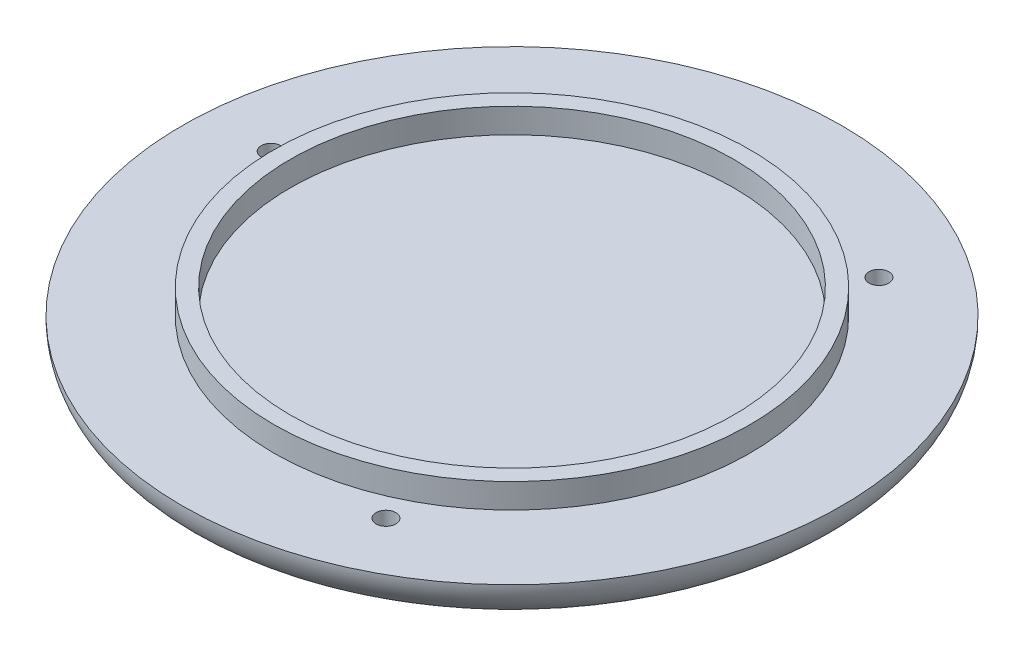
ISO-10303-21;
HEADER;
FILE_DESCRIPTION(('STEP AP214'),'2;1');
FILE_NAME('part.step','',(''),(''),'','','');
FILE_SCHEMA(('AUTOMOTIVE_DESIGN { 1 0 10303 214 1 1 1 1 }'));
ENDSEC;
DATA;
#1=APPLICATION_CONTEXT('core data for automotive mechanical design processes');
#2=APPLICATION_PROTOCOL_DEFINITION('international standard','automotive_design',2000,#1);
#3=PRODUCT_CONTEXT('',#1,'mechanical');
#4=PRODUCT('Part','Part','',(#3));
#5=PRODUCT_RELATED_PRODUCT_CATEGORY('part','',(#4));
#6=PRODUCT_DEFINITION_FORMATION('','',#4);
#7=PRODUCT_DEFINITION_CONTEXT('part definition',#1,'design');
#8=PRODUCT_DEFINITION('design','',#6,#7);
#9=PRODUCT_DEFINITION_SHAPE('','',#8);
#10=(LENGTH_UNIT() NAMED_UNIT(*) SI_UNIT(.MILLI.,.METRE.));
#11=(NAMED_UNIT(*) PLANE_ANGLE_UNIT() SI_UNIT($,.RADIAN.));
#12=(NAMED_UNIT(*) SI_UNIT($,.STERADIAN.) SOLID_ANGLE_UNIT());
#13=UNCERTAINTY_MEASURE_WITH_UNIT(LENGTH_MEASURE(1.E-05),#10,'distance_accuracy_value','');
#14=(GEOMETRIC_REPRESENTATION_CONTEXT(3) GLOBAL_UNCERTAINTY_ASSIGNED_CONTEXT((#13)) GLOBAL_UNIT_ASSIGNED_CONTEXT((#10,
#11,#12)) REPRESENTATION_CONTEXT('',''));
#15=CARTESIAN_POINT('',(0.,0.,0.));
#16=DIRECTION('',(0.,0.,1.));
#17=DIRECTION('',(1.,0.,0.));
#18=AXIS2_PLACEMENT_3D('',#15,#16,#17);
#19=CARTESIAN_POINT('',(0.,0.,0.));
#20=DIRECTION('',(0.,1.,0.));
#21=DIRECTION('',(0.,0.,1.));
#22=AXIS2_PLACEMENT_3D('',#19,#20,#21);
#23=PLANE('',#22);
#24=CARTESIAN_POINT('',(0.,0.,0.));
#25=DIRECTION('',(0.,1.,0.));
#26=DIRECTION('',(0.,0.,1.));
#27=AXIS2_PLACEMENT_3D('',#24,#25,#26);
#28=CIRCLE('',#27,35.);
#29=CARTESIAN_POINT('',(0.,0.,35.));
#30=VERTEX_POINT('',#29);
#31=EDGE_CURVE('E10',#30,#30,#28,.F.);
#32=ORIENTED_EDGE('',*,*,#31,.T.);
#33=EDGE_LOOP('',(#32));
#34=FACE_BOUND('',#33,.T.);
#35=CARTESIAN_POINT('',(-31.8896219755047,0.,-2.65556213623557));
#36=DIRECTION('',(0.,-1.,0.));
#37=DIRECTION('',(0.,0.,-1.));
#38=AXIS2_PLACEMENT_3D('',#35,#36,#37);
#39=CIRCLE('',#38,2.15);
#40=CARTESIAN_POINT('',(-31.8896219755047,0.,-4.80556213623557));
#41=VERTEX_POINT('',#40);
#42=EDGE_CURVE('E75',#41,#41,#39,.T.);
#43=ORIENTED_EDGE('',*,*,#42,.F.);
#44=EDGE_LOOP('',(#43));
#45=FACE_BOUND('',#44,.T.);
#46=CARTESIAN_POINT('',(13.6450267164444,0.,28.9450038159873));
#47=DIRECTION('',(0.,-1.,0.));
#48=DIRECTION('',(0.,0.,-1.));
#49=AXIS2_PLACEMENT_3D('',#46,#47,#48);
#50=CIRCLE('',#49,2.15);
#51=CARTESIAN_POINT('',(13.6450267164444,0.,26.7950038159873));
#52=VERTEX_POINT('',#51);
#53=EDGE_CURVE('E63',#52,#52,#50,.T.);
#54=ORIENTED_EDGE('',*,*,#53,.F.);
#55=EDGE_LOOP('',(#54));
#56=FACE_BOUND('',#55,.T.);
#57=CARTESIAN_POINT('',(18.2445952590606,0.,-26.2894416797517));
#58=DIRECTION('',(0.,-1.,0.));
#59=DIRECTION('',(0.,0.,-1.));
#60=AXIS2_PLACEMENT_3D('',#57,#58,#59);
#61=CIRCLE('',#60,2.15);
#62=CARTESIAN_POINT('',(18.2445952590606,0.,-28.4394416797517));
#63=VERTEX_POINT('',#62);
#64=EDGE_CURVE('E87',#63,#63,#61,.T.);
#65=ORIENTED_EDGE('',*,*,#64,.F.);
#66=EDGE_LOOP('',(#65));
#67=FACE_BOUND('',#66,.T.);
#68=ADVANCED_FACE('F34',(#34,#45,#56,#67),#23,.F.);
#69=CARTESIAN_POINT('',(0.,5.,0.));
#70=DIRECTION('',(0.,1.,0.));
#71=DIRECTION('',(0.,0.,1.));
#72=AXIS2_PLACEMENT_3D('',#69,#70,#71);
#73=PLANE('',#72);
#74=CARTESIAN_POINT('',(18.2445952590606,5.,-26.2894416797517));
#75=DIRECTION('',(0.,1.,0.));
#76=DIRECTION('',(0.,0.,1.));
#77=AXIS2_PLACEMENT_3D('',#74,#75,#76);
#78=CIRCLE('',#77,1.2);
#79=CARTESIAN_POINT('',(18.2445952590606,5.,-25.0894416797517));
#80=VERTEX_POINT('',#79);
#81=EDGE_CURVE('E78',#80,#80,#78,.T.);
#82=ORIENTED_EDGE('',*,*,#81,.F.);
#83=EDGE_LOOP('',(#82));
#84=FACE_BOUND('',#83,.T.);
#85=CARTESIAN_POINT('',(-31.8896219755047,5.,-2.65556213623557));
#86=DIRECTION('',(0.,1.,0.));
#87=DIRECTION('',(0.,0.,1.));
#88=AXIS2_PLACEMENT_3D('',#85,#86,#87);
#89=CIRCLE('',#88,1.2);
#90=CARTESIAN_POINT('',(-31.8896219755047,5.,-1.45556213623557));
#91=VERTEX_POINT('',#90);
#92=EDGE_CURVE('E66',#91,#91,#89,.T.);
#93=ORIENTED_EDGE('',*,*,#92,.F.);
#94=EDGE_LOOP('',(#93));
#95=FACE_BOUND('',#94,.T.);
#96=CARTESIAN_POINT('',(13.6450267164444,5.,28.9450038159873));
#97=DIRECTION('',(0.,1.,0.));
#98=DIRECTION('',(0.,0.,1.));
#99=AXIS2_PLACEMENT_3D('',#96,#97,#98);
#100=CIRCLE('',#99,1.2);
#101=CARTESIAN_POINT('',(13.6450267164444,5.,30.1450038159873));
#102=VERTEX_POINT('',#101);
#103=EDGE_CURVE('E54',#102,#102,#100,.T.);
#104=ORIENTED_EDGE('',*,*,#103,.F.);
#105=EDGE_LOOP('',(#104));
#106=FACE_BOUND('',#105,.T.);
#107=CARTESIAN_POINT('',(0.,5.,0.));
#108=DIRECTION('',(0.,1.,0.));
#109=DIRECTION('',(0.,0.,1.));
#110=AXIS2_PLACEMENT_3D('',#107,#108,#109);
#111=CIRCLE('',#110,28.9);
#112=CARTESIAN_POINT('',(0.,5.,28.9));
#113=VERTEX_POINT('',#112);
#114=EDGE_CURVE('E41',#113,#113,#111,.T.);
#115=ORIENTED_EDGE('',*,*,#114,.F.);
#116=EDGE_LOOP('',(#115));
#117=FACE_BOUND('',#116,.T.);
#118=CARTESIAN_POINT('',(0.,5.,0.));
#119=DIRECTION('',(0.,1.,0.));
#120=DIRECTION('',(0.,0.,1.));
#121=AXIS2_PLACEMENT_3D('',#118,#119,#120);
#122=CIRCLE('',#121,40.);
#123=CARTESIAN_POINT('',(0.,5.,40.));
#124=VERTEX_POINT('',#123);
#125=EDGE_CURVE('E45',#124,#124,#122,.T.);
#126=ORIENTED_EDGE('',*,*,#125,.T.);
#127=EDGE_LOOP('',(#126));
#128=FACE_BOUND('',#127,.T.);
#129=ADVANCED_FACE('F108',(#84,#95,#106,#117,#128),#73,.T.);
#130=CARTESIAN_POINT('',(0.,8.,0.));
#131=DIRECTION('',(0.,-1.,0.));
#132=DIRECTION('',(0.,0.,-1.));
#133=AXIS2_PLACEMENT_3D('',#130,#131,#132);
#134=CYLINDRICAL_SURFACE('',#133,28.9);
#135=CARTESIAN_POINT('',(0.,8.,0.));
#136=DIRECTION('',(0.,1.,0.));
#137=DIRECTION('',(0.,0.,1.));
#138=AXIS2_PLACEMENT_3D('',#135,#136,#137);
#139=CIRCLE('',#138,28.9);
#140=CARTESIAN_POINT('',(0.,8.,28.9));
#141=VERTEX_POINT('',#140);
#142=EDGE_CURVE('E50',#141,#141,#139,.T.);
#143=ORIENTED_EDGE('',*,*,#142,.F.);
#144=EDGE_LOOP('',(#143));
#145=FACE_BOUND('',#144,.T.);
#146=ORIENTED_EDGE('',*,*,#114,.T.);
#147=EDGE_LOOP('',(#146));
#148=FACE_BOUND('',#147,.T.);
#149=ADVANCED_FACE('F103',(#145,#148),#134,.T.);
#150=CARTESIAN_POINT('',(0.,8.,0.));
#151=DIRECTION('',(0.,1.,0.));
#152=DIRECTION('',(0.,0.,1.));
#153=AXIS2_PLACEMENT_3D('',#150,#151,#152);
#154=PLANE('',#153);
#155=CARTESIAN_POINT('',(0.,8.,0.));
#156=DIRECTION('',(0.,1.,0.));
#157=DIRECTION('',(0.,0.,1.));
#158=AXIS2_PLACEMENT_3D('',#155,#156,#157);
#159=CIRCLE('',#158,26.9);
#160=CARTESIAN_POINT('',(0.,8.,26.9));
#161=VERTEX_POINT('',#160);
#162=EDGE_CURVE('E93',#161,#161,#159,.T.);
#163=ORIENTED_EDGE('',*,*,#162,.F.);
#164=EDGE_LOOP('',(#163));
#165=FACE_BOUND('',#164,.T.);
#166=ORIENTED_EDGE('',*,*,#142,.T.);
#167=EDGE_LOOP('',(#166));
#168=FACE_BOUND('',#167,.T.);
#169=ADVANCED_FACE('F99',(#165,#168),#154,.T.);
#170=CARTESIAN_POINT('',(13.6450267164444,0.,28.9450038159873));
#171=DIRECTION('',(0.,-1.,0.));
#172=DIRECTION('',(0.,0.,-1.));
#173=AXIS2_PLACEMENT_3D('',#170,#171,#172);
#174=CYLINDRICAL_SURFACE('',#173,1.2);
#175=CARTESIAN_POINT('',(13.6450267164444,2.3,28.9450038159873));
#176=DIRECTION('',(0.,-1.,0.));
#177=DIRECTION('',(0.,0.,-1.));
#178=AXIS2_PLACEMENT_3D('',#175,#176,#177);
#179=CIRCLE('',#178,1.2);
#180=CARTESIAN_POINT('',(13.6450267164444,2.3,27.7450038159873));
#181=VERTEX_POINT('',#180);
#182=EDGE_CURVE('E57',#181,#181,#179,.T.);
#183=ORIENTED_EDGE('',*,*,#182,.T.);
#184=EDGE_LOOP('',(#183));
#185=FACE_BOUND('',#184,.T.);
#186=ORIENTED_EDGE('',*,*,#103,.T.);
#187=EDGE_LOOP('',(#186));
#188=FACE_BOUND('',#187,.T.);
#189=ADVANCED_FACE('F102',(#185,#188),#174,.F.);
#190=CARTESIAN_POINT('',(14.8450267164444,2.3,28.9450038159873));
#191=DIRECTION('',(0.,1.,0.));
#192=DIRECTION('',(0.,0.,1.));
#193=AXIS2_PLACEMENT_3D('',#190,#191,#192);
#194=PLANE('',#193);
#195=ORIENTED_EDGE('',*,*,#182,.F.);
#196=EDGE_LOOP('',(#195));
#197=FACE_BOUND('',#196,.T.);
#198=CARTESIAN_POINT('',(13.6450267164444,2.3,28.9450038159873));
#199=DIRECTION('',(0.,-1.,0.));
#200=DIRECTION('',(0.,0.,-1.));
#201=AXIS2_PLACEMENT_3D('',#198,#199,#200);
#202=CIRCLE('',#201,2.15);
#203=CARTESIAN_POINT('',(13.6450267164444,2.3,26.7950038159873));
#204=VERTEX_POINT('',#203);
#205=EDGE_CURVE('E60',#204,#204,#202,.T.);
#206=ORIENTED_EDGE('',*,*,#205,.T.);
#207=EDGE_LOOP('',(#206));
#208=FACE_BOUND('',#207,.T.);
#209=ADVANCED_FACE('F161',(#197,#208),#194,.F.);
#210=CARTESIAN_POINT('',(13.6450267164444,0.,28.9450038159873));
#211=DIRECTION('',(0.,-1.,0.));
#212=DIRECTION('',(0.,0.,-1.));
#213=AXIS2_PLACEMENT_3D('',#210,#211,#212);
#214=CYLINDRICAL_SURFACE('',#213,2.15);
#215=ORIENTED_EDGE('',*,*,#205,.F.);
#216=EDGE_LOOP('',(#215));
#217=FACE_BOUND('',#216,.T.);
#218=ORIENTED_EDGE('',*,*,#53,.T.);
#219=EDGE_LOOP('',(#218));
#220=FACE_BOUND('',#219,.T.);
#221=ADVANCED_FACE('F157',(#217,#220),#214,.F.);
#222=CARTESIAN_POINT('',(-31.8896219755047,0.,-2.65556213623557));
#223=DIRECTION('',(0.,-1.,0.));
#224=DIRECTION('',(0.,0.,-1.));
#225=AXIS2_PLACEMENT_3D('',#222,#223,#224);
#226=CYLINDRICAL_SURFACE('',#225,1.2);
#227=CARTESIAN_POINT('',(-31.8896219755047,2.3,-2.65556213623557));
#228=DIRECTION('',(0.,-1.,0.));
#229=DIRECTION('',(0.,0.,-1.));
#230=AXIS2_PLACEMENT_3D('',#227,#228,#229);
#231=CIRCLE('',#230,1.2);
#232=CARTESIAN_POINT('',(-31.8896219755047,2.3,-3.85556213623557));
#233=VERTEX_POINT('',#232);
#234=EDGE_CURVE('E69',#233,#233,#231,.T.);
#235=ORIENTED_EDGE('',*,*,#234,.T.);
#236=EDGE_LOOP('',(#235));
#237=FACE_BOUND('',#236,.T.);
#238=ORIENTED_EDGE('',*,*,#92,.T.);
#239=EDGE_LOOP('',(#238));
#240=FACE_BOUND('',#239,.T.);
#241=ADVANCED_FACE('F153',(#237,#240),#226,.F.);
#242=CARTESIAN_POINT('',(-30.6896219755047,2.3,-2.65556213623557));
#243=DIRECTION('',(0.,1.,0.));
#244=DIRECTION('',(0.,0.,1.));
#245=AXIS2_PLACEMENT_3D('',#242,#243,#244);
#246=PLANE('',#245);
#247=ORIENTED_EDGE('',*,*,#234,.F.);
#248=EDGE_LOOP('',(#247));
#249=FACE_BOUND('',#248,.T.);
#250=CARTESIAN_POINT('',(-31.8896219755047,2.3,-2.65556213623557));
#251=DIRECTION('',(0.,-1.,0.));
#252=DIRECTION('',(0.,0.,-1.));
#253=AXIS2_PLACEMENT_3D('',#250,#251,#252);
#254=CIRCLE('',#253,2.15);
#255=CARTESIAN_POINT('',(-31.8896219755047,2.3,-4.80556213623557));
#256=VERTEX_POINT('',#255);
#257=EDGE_CURVE('E72',#256,#256,#254,.T.);
#258=ORIENTED_EDGE('',*,*,#257,.T.);
#259=EDGE_LOOP('',(#258));
#260=FACE_BOUND('',#259,.T.);
#261=ADVANCED_FACE('F149',(#249,#260),#246,.F.);
#262=CARTESIAN_POINT('',(-31.8896219755047,0.,-2.65556213623557));
#263=DIRECTION('',(0.,-1.,0.));
#264=DIRECTION('',(0.,0.,-1.));
#265=AXIS2_PLACEMENT_3D('',#262,#263,#264);
#266=CYLINDRICAL_SURFACE('',#265,2.15);
#267=ORIENTED_EDGE('',*,*,#257,.F.);
#268=EDGE_LOOP('',(#267));
#269=FACE_BOUND('',#268,.T.);
#270=ORIENTED_EDGE('',*,*,#42,.T.);
#271=EDGE_LOOP('',(#270));
#272=FACE_BOUND('',#271,.T.);
#273=ADVANCED_FACE('F145',(#269,#272),#266,.F.);
#274=CARTESIAN_POINT('',(18.2445952590606,0.,-26.2894416797517));
#275=DIRECTION('',(0.,-1.,0.));
#276=DIRECTION('',(0.,0.,-1.));
#277=AXIS2_PLACEMENT_3D('',#274,#275,#276);
#278=CYLINDRICAL_SURFACE('',#277,1.2);
#279=CARTESIAN_POINT('',(18.2445952590606,2.3,-26.2894416797517));
#280=DIRECTION('',(0.,-1.,0.));
#281=DIRECTION('',(0.,0.,-1.));
#282=AXIS2_PLACEMENT_3D('',#279,#280,#281);
#283=CIRCLE('',#282,1.2);
#284=CARTESIAN_POINT('',(18.2445952590606,2.3,-27.4894416797517));
#285=VERTEX_POINT('',#284);
#286=EDGE_CURVE('E81',#285,#285,#283,.T.);
#287=ORIENTED_EDGE('',*,*,#286,.T.);
#288=EDGE_LOOP('',(#287));
#289=FACE_BOUND('',#288,.T.);
#290=ORIENTED_EDGE('',*,*,#81,.T.);
#291=EDGE_LOOP('',(#290));
#292=FACE_BOUND('',#291,.T.);
#293=ADVANCED_FACE('F137',(#289,#292),#278,.F.);
#294=CARTESIAN_POINT('',(19.4445952590606,2.3,-26.2894416797517));
#295=DIRECTION('',(0.,1.,0.));
#296=DIRECTION('',(0.,0.,1.));
#297=AXIS2_PLACEMENT_3D('',#294,#295,#296);
#298=PLANE('',#297);
#299=ORIENTED_EDGE('',*,*,#286,.F.);
#300=EDGE_LOOP('',(#299));
#301=FACE_BOUND('',#300,.T.);
#302=CARTESIAN_POINT('',(18.2445952590606,2.3,-26.2894416797517));
#303=DIRECTION('',(0.,-1.,0.));
#304=DIRECTION('',(0.,0.,-1.));
#305=AXIS2_PLACEMENT_3D('',#302,#303,#304);
#306=CIRCLE('',#305,2.15);
#307=CARTESIAN_POINT('',(18.2445952590606,2.3,-28.4394416797517));
#308=VERTEX_POINT('',#307);
#309=EDGE_CURVE('E84',#308,#308,#306,.T.);
#310=ORIENTED_EDGE('',*,*,#309,.T.);
#311=EDGE_LOOP('',(#310));
#312=FACE_BOUND('',#311,.T.);
#313=ADVANCED_FACE('F127',(#301,#312),#298,.F.);
#314=CARTESIAN_POINT('',(18.2445952590606,0.,-26.2894416797517));
#315=DIRECTION('',(0.,-1.,0.));
#316=DIRECTION('',(0.,0.,-1.));
#317=AXIS2_PLACEMENT_3D('',#314,#315,#316);
#318=CYLINDRICAL_SURFACE('',#317,2.15);
#319=ORIENTED_EDGE('',*,*,#309,.F.);
#320=EDGE_LOOP('',(#319));
#321=FACE_BOUND('',#320,.T.);
#322=ORIENTED_EDGE('',*,*,#64,.T.);
#323=EDGE_LOOP('',(#322));
#324=FACE_BOUND('',#323,.T.);
#325=ADVANCED_FACE('F125',(#321,#324),#318,.F.);
#326=CARTESIAN_POINT('',(0.,-71.0846896556725,0.));
#327=DIRECTION('',(0.,1.,0.));
#328=DIRECTION('',(0.,0.,1.));
#329=AXIS2_PLACEMENT_3D('',#326,#327,#328);
#330=CYLINDRICAL_SURFACE('',#329,26.9);
#331=CARTESIAN_POINT('',(0.,5.,0.));
#332=DIRECTION('',(0.,1.,0.));
#333=DIRECTION('',(0.,0.,1.));
#334=AXIS2_PLACEMENT_3D('',#331,#332,#333);
#335=CIRCLE('',#334,26.9);
#336=CARTESIAN_POINT('',(0.,5.,26.9));
#337=VERTEX_POINT('',#336);
#338=EDGE_CURVE('E90',#337,#337,#335,.F.);
#339=ORIENTED_EDGE('',*,*,#338,.T.);
#340=EDGE_LOOP('',(#339));
#341=FACE_BOUND('',#340,.T.);
#342=ORIENTED_EDGE('',*,*,#162,.T.);
#343=EDGE_LOOP('',(#342));
#344=FACE_BOUND('',#343,.T.);
#345=ADVANCED_FACE('F97',(#341,#344),#330,.F.);
#346=CARTESIAN_POINT('',(0.,5.,0.));
#347=DIRECTION('',(0.,1.,0.));
#348=DIRECTION('',(0.,0.,1.));
#349=AXIS2_PLACEMENT_3D('',#346,#347,#348);
#350=PLANE('',#349);
#351=ORIENTED_EDGE('',*,*,#338,.F.);
#352=EDGE_LOOP('',(#351));
#353=FACE_BOUND('',#352,.T.);
#354=ADVANCED_FACE('F134',(#353),#350,.T.);
#355=CARTESIAN_POINT('',(0.,5.,0.));
#356=DIRECTION('',(0.,1.,0.));
#357=DIRECTION('',(0.,0.,1.));
#358=AXIS2_PLACEMENT_3D('',#355,#356,#357);
#359=TOROIDAL_SURFACE('',#358,35.,5.);
#360=ORIENTED_EDGE('',*,*,#31,.F.);
#361=EDGE_LOOP('',(#360));
#362=FACE_BOUND('',#361,.T.);
#363=ORIENTED_EDGE('',*,*,#125,.F.);
#364=EDGE_LOOP('',(#363));
#365=FACE_BOUND('',#364,.T.);
#366=ADVANCED_FACE('F36',(#362,#365),#359,.T.);
#367=CLOSED_SHELL('',(#68,#129,#149,#169,#189,#209,#221,#241,#261,#273,#293,#313,#325,#345,#354,#366));
#368=MANIFOLD_SOLID_BREP('B2',#367);
#369=ADVANCED_BREP_SHAPE_REPRESENTATION('',(#18,#368),#14);
#370=SHAPE_DEFINITION_REPRESENTATION(#9,#369);
ENDSEC;
END-ISO-10303-21;
